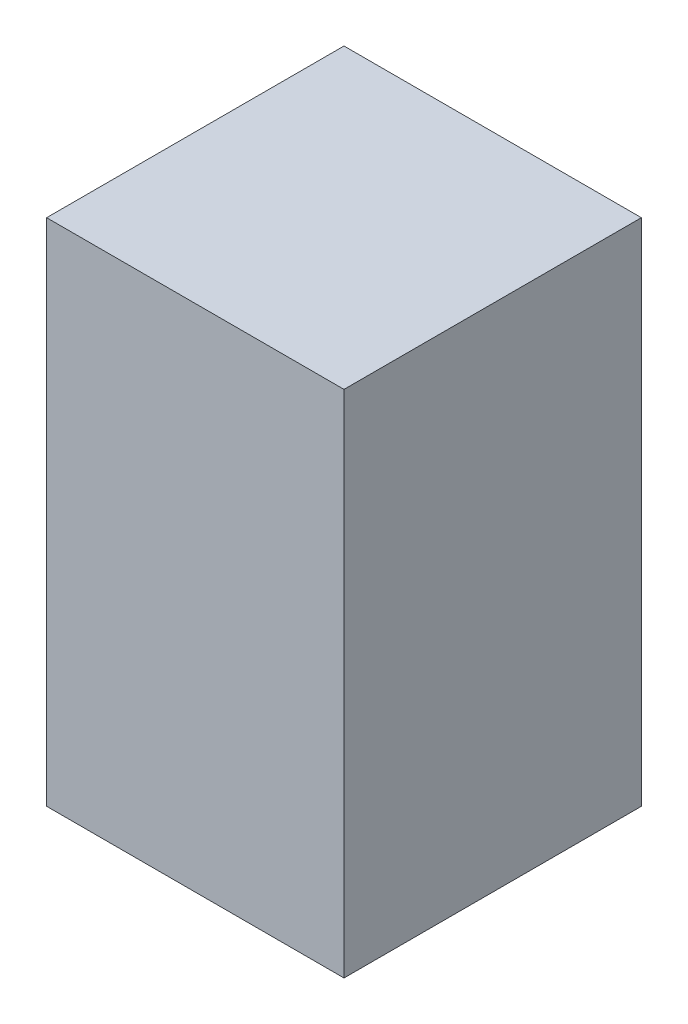
ISO-10303-21;
HEADER;
FILE_DESCRIPTION(('STEP AP214'),'2;1');
FILE_NAME('part.step','',(''),(''),'','','');
FILE_SCHEMA(('AUTOMOTIVE_DESIGN { 1 0 10303 214 1 1 1 1 }'));
ENDSEC;
DATA;
#1=APPLICATION_CONTEXT('core data for automotive mechanical design processes');
#2=APPLICATION_PROTOCOL_DEFINITION('international standard','automotive_design',2000,#1);
#3=PRODUCT_CONTEXT('',#1,'mechanical');
#4=PRODUCT('Part','Part','',(#3));
#5=PRODUCT_RELATED_PRODUCT_CATEGORY('part','',(#4));
#6=PRODUCT_DEFINITION_FORMATION('','',#4);
#7=PRODUCT_DEFINITION_CONTEXT('part definition',#1,'design');
#8=PRODUCT_DEFINITION('design','',#6,#7);
#9=PRODUCT_DEFINITION_SHAPE('','',#8);
#10=(LENGTH_UNIT() NAMED_UNIT(*) SI_UNIT(.MILLI.,.METRE.));
#11=(NAMED_UNIT(*) PLANE_ANGLE_UNIT() SI_UNIT($,.RADIAN.));
#12=(NAMED_UNIT(*) SI_UNIT($,.STERADIAN.) SOLID_ANGLE_UNIT());
#13=UNCERTAINTY_MEASURE_WITH_UNIT(LENGTH_MEASURE(1.E-05),#10,'distance_accuracy_value','');
#14=(GEOMETRIC_REPRESENTATION_CONTEXT(3) GLOBAL_UNCERTAINTY_ASSIGNED_CONTEXT((#13)) GLOBAL_UNIT_ASSIGNED_CONTEXT((#10,
#11,#12)) REPRESENTATION_CONTEXT('',''));
#15=CARTESIAN_POINT('',(0.,0.,0.));
#16=DIRECTION('',(0.,0.,1.));
#17=DIRECTION('',(1.,0.,0.));
#18=AXIS2_PLACEMENT_3D('',#15,#16,#17);
#19=CARTESIAN_POINT('',(350.,1200.,350.));
#20=DIRECTION('',(-1.,0.,0.));
#21=DIRECTION('',(0.,0.,1.));
#22=AXIS2_PLACEMENT_3D('',#19,#20,#21);
#23=PLANE('',#22);
#24=DIRECTION('',(0.,0.,-1.));
#25=VECTOR('',#24,1.);
#26=CARTESIAN_POINT('',(350.,0.,350.));
#27=LINE('',#26,#25);
#28=CARTESIAN_POINT('',(350.,0.,350.));
#29=VERTEX_POINT('',#28);
#30=CARTESIAN_POINT('',(350.,0.,-350.));
#31=VERTEX_POINT('',#30);
#32=EDGE_CURVE('E96',#29,#31,#27,.T.);
#33=ORIENTED_EDGE('',*,*,#32,.T.);
#34=DIRECTION('',(0.,-1.,0.));
#35=VECTOR('',#34,1.);
#36=CARTESIAN_POINT('',(350.,1200.,-350.));
#37=LINE('',#36,#35);
#38=CARTESIAN_POINT('',(350.,1200.,-350.));
#39=VERTEX_POINT('',#38);
#40=EDGE_CURVE('E11',#39,#31,#37,.T.);
#41=ORIENTED_EDGE('',*,*,#40,.F.);
#42=DIRECTION('',(0.,0.,-1.));
#43=VECTOR('',#42,1.);
#44=CARTESIAN_POINT('',(350.,1200.,350.));
#45=LINE('',#44,#43);
#46=CARTESIAN_POINT('',(350.,1200.,350.));
#47=VERTEX_POINT('',#46);
#48=EDGE_CURVE('E84',#47,#39,#45,.T.);
#49=ORIENTED_EDGE('',*,*,#48,.F.);
#50=DIRECTION('',(0.,-1.,0.));
#51=VECTOR('',#50,1.);
#52=CARTESIAN_POINT('',(350.,1200.,350.));
#53=LINE('',#52,#51);
#54=EDGE_CURVE('E92',#47,#29,#53,.T.);
#55=ORIENTED_EDGE('',*,*,#54,.T.);
#56=EDGE_LOOP('',(#33,#41,#49,#55));
#57=FACE_BOUND('',#56,.T.);
#58=ADVANCED_FACE('F33',(#57),#23,.F.);
#59=CARTESIAN_POINT('',(-350.,1200.,-350.));
#60=DIRECTION('',(0.,0.,1.));
#61=DIRECTION('',(1.,0.,0.));
#62=AXIS2_PLACEMENT_3D('',#59,#60,#61);
#63=PLANE('',#62);
#64=DIRECTION('',(-1.,0.,0.));
#65=VECTOR('',#64,1.);
#66=CARTESIAN_POINT('',(-350.,0.,-350.));
#67=LINE('',#66,#65);
#68=CARTESIAN_POINT('',(-350.,0.,-350.));
#69=VERTEX_POINT('',#68);
#70=EDGE_CURVE('E88',#31,#69,#67,.T.);
#71=ORIENTED_EDGE('',*,*,#70,.T.);
#72=DIRECTION('',(0.,-1.,0.));
#73=VECTOR('',#72,1.);
#74=CARTESIAN_POINT('',(-350.,1200.,-350.));
#75=LINE('',#74,#73);
#76=CARTESIAN_POINT('',(-350.,1200.,-350.));
#77=VERTEX_POINT('',#76);
#78=EDGE_CURVE('E41',#77,#69,#75,.T.);
#79=ORIENTED_EDGE('',*,*,#78,.F.);
#80=DIRECTION('',(-1.,0.,0.));
#81=VECTOR('',#80,1.);
#82=CARTESIAN_POINT('',(-350.,1200.,-350.));
#83=LINE('',#82,#81);
#84=EDGE_CURVE('E79',#39,#77,#83,.T.);
#85=ORIENTED_EDGE('',*,*,#84,.F.);
#86=ORIENTED_EDGE('',*,*,#40,.T.);
#87=EDGE_LOOP('',(#71,#79,#85,#86));
#88=FACE_BOUND('',#87,.T.);
#89=ADVANCED_FACE('F87',(#88),#63,.F.);
#90=CARTESIAN_POINT('',(-350.,1200.,350.));
#91=DIRECTION('',(1.,0.,0.));
#92=DIRECTION('',(0.,0.,-1.));
#93=AXIS2_PLACEMENT_3D('',#90,#91,#92);
#94=PLANE('',#93);
#95=DIRECTION('',(0.,0.,1.));
#96=VECTOR('',#95,1.);
#97=CARTESIAN_POINT('',(-350.,0.,350.));
#98=LINE('',#97,#96);
#99=CARTESIAN_POINT('',(-350.,0.,350.));
#100=VERTEX_POINT('',#99);
#101=EDGE_CURVE('E66',#69,#100,#98,.T.);
#102=ORIENTED_EDGE('',*,*,#101,.T.);
#103=DIRECTION('',(0.,-1.,0.));
#104=VECTOR('',#103,1.);
#105=CARTESIAN_POINT('',(-350.,1200.,350.));
#106=LINE('',#105,#104);
#107=CARTESIAN_POINT('',(-350.,1200.,350.));
#108=VERTEX_POINT('',#107);
#109=EDGE_CURVE('E89',#108,#100,#106,.T.);
#110=ORIENTED_EDGE('',*,*,#109,.F.);
#111=DIRECTION('',(0.,0.,1.));
#112=VECTOR('',#111,1.);
#113=CARTESIAN_POINT('',(-350.,1200.,350.));
#114=LINE('',#113,#112);
#115=EDGE_CURVE('E82',#77,#108,#114,.T.);
#116=ORIENTED_EDGE('',*,*,#115,.F.);
#117=ORIENTED_EDGE('',*,*,#78,.T.);
#118=EDGE_LOOP('',(#102,#110,#116,#117));
#119=FACE_BOUND('',#118,.T.);
#120=ADVANCED_FACE('F90',(#119),#94,.F.);
#121=CARTESIAN_POINT('',(-350.,1200.,350.));
#122=DIRECTION('',(0.,0.,-1.));
#123=DIRECTION('',(-1.,0.,0.));
#124=AXIS2_PLACEMENT_3D('',#121,#122,#123);
#125=PLANE('',#124);
#126=DIRECTION('',(1.,0.,0.));
#127=VECTOR('',#126,1.);
#128=CARTESIAN_POINT('',(-350.,0.,350.));
#129=LINE('',#128,#127);
#130=EDGE_CURVE('E72',#100,#29,#129,.T.);
#131=ORIENTED_EDGE('',*,*,#130,.T.);
#132=ORIENTED_EDGE('',*,*,#54,.F.);
#133=DIRECTION('',(1.,0.,0.));
#134=VECTOR('',#133,1.);
#135=CARTESIAN_POINT('',(-350.,1200.,350.));
#136=LINE('',#135,#134);
#137=EDGE_CURVE('E49',#108,#47,#136,.T.);
#138=ORIENTED_EDGE('',*,*,#137,.F.);
#139=ORIENTED_EDGE('',*,*,#109,.T.);
#140=EDGE_LOOP('',(#131,#132,#138,#139));
#141=FACE_BOUND('',#140,.T.);
#142=ADVANCED_FACE('F103',(#141),#125,.F.);
#143=CARTESIAN_POINT('',(0.,1200.,0.));
#144=DIRECTION('',(0.,-1.,0.));
#145=DIRECTION('',(0.,0.,-1.));
#146=AXIS2_PLACEMENT_3D('',#143,#144,#145);
#147=PLANE('',#146);
#148=ORIENTED_EDGE('',*,*,#48,.T.);
#149=ORIENTED_EDGE('',*,*,#84,.T.);
#150=ORIENTED_EDGE('',*,*,#115,.T.);
#151=ORIENTED_EDGE('',*,*,#137,.T.);
#152=EDGE_LOOP('',(#148,#149,#150,#151));
#153=FACE_BOUND('',#152,.T.);
#154=ADVANCED_FACE('F80',(#153),#147,.F.);
#155=CARTESIAN_POINT('',(0.,0.,0.));
#156=DIRECTION('',(0.,-1.,0.));
#157=DIRECTION('',(0.,0.,-1.));
#158=AXIS2_PLACEMENT_3D('',#155,#156,#157);
#159=PLANE('',#158);
#160=ORIENTED_EDGE('',*,*,#32,.F.);
#161=ORIENTED_EDGE('',*,*,#130,.F.);
#162=ORIENTED_EDGE('',*,*,#101,.F.);
#163=ORIENTED_EDGE('',*,*,#70,.F.);
#164=EDGE_LOOP('',(#160,#161,#162,#163));
#165=FACE_BOUND('',#164,.T.);
#166=ADVANCED_FACE('F106',(#165),#159,.T.);
#167=CLOSED_SHELL('',(#58,#89,#120,#142,#154,#166));
#168=MANIFOLD_SOLID_BREP('B2',#167);
#169=ADVANCED_BREP_SHAPE_REPRESENTATION('',(#18,#168),#14);
#170=SHAPE_DEFINITION_REPRESENTATION(#9,#169);
ENDSEC;
END-ISO-10303-21;
